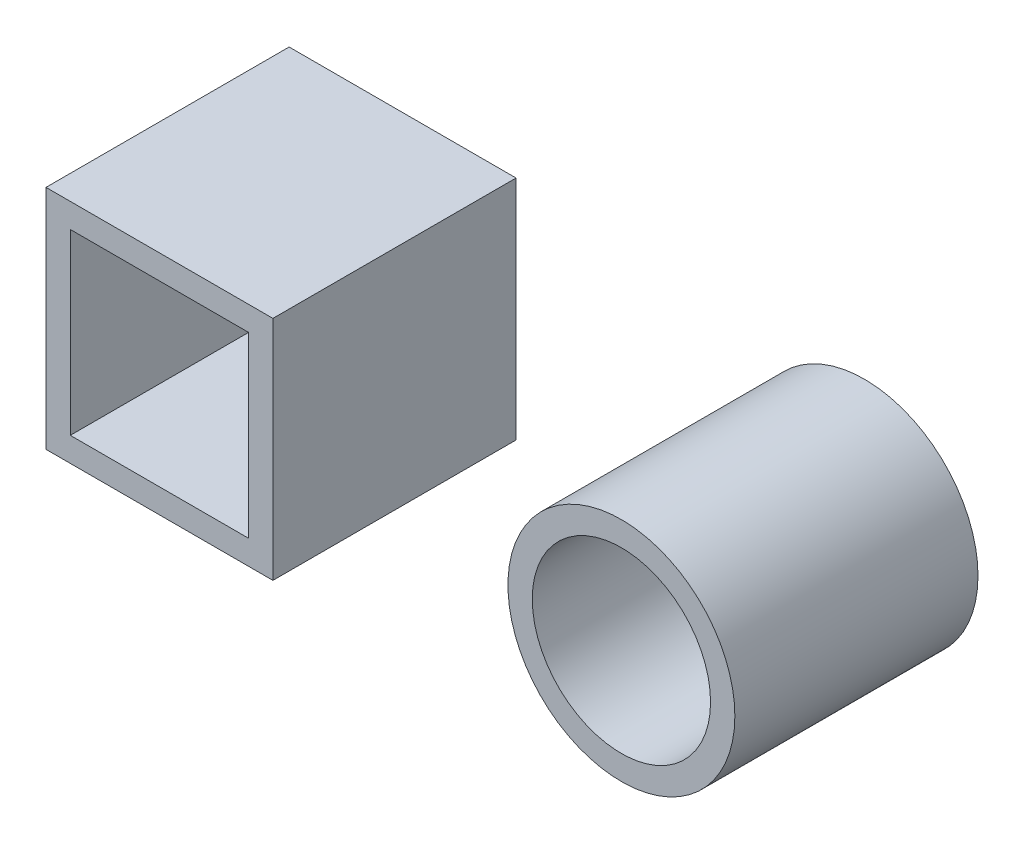
ISO-10303-21;
HEADER;
FILE_DESCRIPTION(('STEP AP214'),'2;1');
FILE_NAME('part.step','',(''),(''),'','','');
FILE_SCHEMA(('AUTOMOTIVE_DESIGN { 1 0 10303 214 1 1 1 1 }'));
ENDSEC;
DATA;
#1=APPLICATION_CONTEXT('core data for automotive mechanical design processes');
#2=APPLICATION_PROTOCOL_DEFINITION('international standard','automotive_design',2000,#1);
#3=PRODUCT_CONTEXT('',#1,'mechanical');
#4=PRODUCT('Part','Part','',(#3));
#5=PRODUCT_RELATED_PRODUCT_CATEGORY('part','',(#4));
#6=PRODUCT_DEFINITION_FORMATION('','',#4);
#7=PRODUCT_DEFINITION_CONTEXT('part definition',#1,'design');
#8=PRODUCT_DEFINITION('design','',#6,#7);
#9=PRODUCT_DEFINITION_SHAPE('','',#8);
#10=(LENGTH_UNIT() NAMED_UNIT(*) SI_UNIT(.MILLI.,.METRE.));
#11=(NAMED_UNIT(*) PLANE_ANGLE_UNIT() SI_UNIT($,.RADIAN.));
#12=(NAMED_UNIT(*) SI_UNIT($,.STERADIAN.) SOLID_ANGLE_UNIT());
#13=UNCERTAINTY_MEASURE_WITH_UNIT(LENGTH_MEASURE(1.E-05),#10,'distance_accuracy_value','');
#14=(GEOMETRIC_REPRESENTATION_CONTEXT(3) GLOBAL_UNCERTAINTY_ASSIGNED_CONTEXT((#13)) GLOBAL_UNIT_ASSIGNED_CONTEXT((#10,
#11,#12)) REPRESENTATION_CONTEXT('',''));
#15=CARTESIAN_POINT('',(0.,0.,0.));
#16=DIRECTION('',(0.,0.,1.));
#17=DIRECTION('',(1.,0.,0.));
#18=AXIS2_PLACEMENT_3D('',#15,#16,#17);
#19=CARTESIAN_POINT('',(72.5,0.,-75.));
#20=DIRECTION('',(0.,0.,1.));
#21=DIRECTION('',(1.,0.,0.));
#22=AXIS2_PLACEMENT_3D('',#19,#20,#21);
#23=CYLINDRICAL_SURFACE('',#22,27.5);
#24=CARTESIAN_POINT('',(72.5,0.,-75.));
#25=DIRECTION('',(0.,0.,1.));
#26=DIRECTION('',(1.,0.,0.));
#27=AXIS2_PLACEMENT_3D('',#24,#25,#26);
#28=CIRCLE('',#27,27.5);
#29=CARTESIAN_POINT('',(100.,0.,-75.));
#30=VERTEX_POINT('',#29);
#31=EDGE_CURVE('E54',#30,#30,#28,.T.);
#32=ORIENTED_EDGE('',*,*,#31,.F.);
#33=EDGE_LOOP('',(#32));
#34=FACE_BOUND('',#33,.T.);
#35=CARTESIAN_POINT('',(72.5,0.,0.));
#36=DIRECTION('',(0.,0.,1.));
#37=DIRECTION('',(1.,0.,0.));
#38=AXIS2_PLACEMENT_3D('',#35,#36,#37);
#39=CIRCLE('',#38,27.5);
#40=CARTESIAN_POINT('',(100.,0.,0.));
#41=VERTEX_POINT('',#40);
#42=EDGE_CURVE('E60',#41,#41,#39,.T.);
#43=ORIENTED_EDGE('',*,*,#42,.T.);
#44=EDGE_LOOP('',(#43));
#45=FACE_BOUND('',#44,.T.);
#46=ADVANCED_FACE('F47',(#34,#45),#23,.F.);
#47=CARTESIAN_POINT('',(72.5,0.,-75.));
#48=DIRECTION('',(0.,0.,1.));
#49=DIRECTION('',(1.,0.,0.));
#50=AXIS2_PLACEMENT_3D('',#47,#48,#49);
#51=CYLINDRICAL_SURFACE('',#50,35.);
#52=CARTESIAN_POINT('',(72.5,0.,-75.));
#53=DIRECTION('',(0.,0.,1.));
#54=DIRECTION('',(1.,0.,0.));
#55=AXIS2_PLACEMENT_3D('',#52,#53,#54);
#56=CIRCLE('',#55,35.);
#57=CARTESIAN_POINT('',(107.5,0.,-75.));
#58=VERTEX_POINT('',#57);
#59=EDGE_CURVE('E11',#58,#58,#56,.T.);
#60=ORIENTED_EDGE('',*,*,#59,.T.);
#61=EDGE_LOOP('',(#60));
#62=FACE_BOUND('',#61,.T.);
#63=CARTESIAN_POINT('',(72.5,0.,0.));
#64=DIRECTION('',(0.,0.,1.));
#65=DIRECTION('',(1.,0.,0.));
#66=AXIS2_PLACEMENT_3D('',#63,#64,#65);
#67=CIRCLE('',#66,35.);
#68=CARTESIAN_POINT('',(107.5,0.,0.));
#69=VERTEX_POINT('',#68);
#70=EDGE_CURVE('E50',#69,#69,#67,.T.);
#71=ORIENTED_EDGE('',*,*,#70,.F.);
#72=EDGE_LOOP('',(#71));
#73=FACE_BOUND('',#72,.T.);
#74=ADVANCED_FACE('F69',(#62,#73),#51,.T.);
#75=CARTESIAN_POINT('',(0.,0.,-75.));
#76=DIRECTION('',(0.,0.,1.));
#77=DIRECTION('',(1.,0.,0.));
#78=AXIS2_PLACEMENT_3D('',#75,#76,#77);
#79=PLANE('',#78);
#80=ORIENTED_EDGE('',*,*,#31,.T.);
#81=EDGE_LOOP('',(#80));
#82=FACE_BOUND('',#81,.T.);
#83=ORIENTED_EDGE('',*,*,#59,.F.);
#84=EDGE_LOOP('',(#83));
#85=FACE_BOUND('',#84,.T.);
#86=ADVANCED_FACE('F71',(#82,#85),#79,.F.);
#87=CARTESIAN_POINT('',(0.,0.,0.));
#88=DIRECTION('',(0.,0.,1.));
#89=DIRECTION('',(1.,0.,0.));
#90=AXIS2_PLACEMENT_3D('',#87,#88,#89);
#91=PLANE('',#90);
#92=ORIENTED_EDGE('',*,*,#42,.F.);
#93=EDGE_LOOP('',(#92));
#94=FACE_BOUND('',#93,.T.);
#95=ORIENTED_EDGE('',*,*,#70,.T.);
#96=EDGE_LOOP('',(#95));
#97=FACE_BOUND('',#96,.T.);
#98=ADVANCED_FACE('F67',(#94,#97),#91,.T.);
#99=CLOSED_SHELL('',(#46,#74,#86,#98));
#100=MANIFOLD_SOLID_BREP('B2',#99);
#101=CARTESIAN_POINT('',(0.,35.,-75.));
#102=DIRECTION('',(0.,1.,0.));
#103=DIRECTION('',(-1.,0.,0.));
#104=AXIS2_PLACEMENT_3D('',#101,#102,#103);
#105=PLANE('',#104);
#106=DIRECTION('',(-1.,0.,0.));
#107=VECTOR('',#106,1.);
#108=CARTESIAN_POINT('',(0.,35.,0.));
#109=LINE('',#108,#107);
#110=CARTESIAN_POINT('',(-35.,35.,0.));
#111=VERTEX_POINT('',#110);
#112=CARTESIAN_POINT('',(-105.,34.9999999999999,0.));
#113=VERTEX_POINT('',#112);
#114=EDGE_CURVE('E229',#111,#113,#109,.T.);
#115=ORIENTED_EDGE('',*,*,#114,.F.);
#116=DIRECTION('',(0.,0.,1.));
#117=VECTOR('',#116,1.);
#118=CARTESIAN_POINT('',(-35.,35.,-75.));
#119=LINE('',#118,#117);
#120=CARTESIAN_POINT('',(-35.,35.,-75.));
#121=VERTEX_POINT('',#120);
#122=EDGE_CURVE('E45',#121,#111,#119,.T.);
#123=ORIENTED_EDGE('',*,*,#122,.F.);
#124=DIRECTION('',(-1.,0.,0.));
#125=VECTOR('',#124,1.);
#126=CARTESIAN_POINT('',(0.,35.,-75.));
#127=LINE('',#126,#125);
#128=CARTESIAN_POINT('',(-105.,34.9999999999999,-75.));
#129=VERTEX_POINT('',#128);
#130=EDGE_CURVE('E205',#121,#129,#127,.T.);
#131=ORIENTED_EDGE('',*,*,#130,.T.);
#132=DIRECTION('',(0.,0.,1.));
#133=VECTOR('',#132,1.);
#134=CARTESIAN_POINT('',(-105.,34.9999999999999,-75.));
#135=LINE('',#134,#133);
#136=EDGE_CURVE('E201',#129,#113,#135,.T.);
#137=ORIENTED_EDGE('',*,*,#136,.T.);
#138=EDGE_LOOP('',(#115,#123,#131,#137));
#139=FACE_BOUND('',#138,.T.);
#140=ADVANCED_FACE('F109',(#139),#105,.T.);
#141=CARTESIAN_POINT('',(-35.,0.,-75.));
#142=DIRECTION('',(-1.,0.,0.));
#143=DIRECTION('',(0.,-1.,0.));
#144=AXIS2_PLACEMENT_3D('',#141,#142,#143);
#145=PLANE('',#144);
#146=DIRECTION('',(0.,-1.,0.));
#147=VECTOR('',#146,1.);
#148=CARTESIAN_POINT('',(-35.,0.,0.));
#149=LINE('',#148,#147);
#150=CARTESIAN_POINT('',(-34.9999999999999,-35.,0.));
#151=VERTEX_POINT('',#150);
#152=EDGE_CURVE('E238',#111,#151,#149,.T.);
#153=ORIENTED_EDGE('',*,*,#152,.T.);
#154=DIRECTION('',(0.,0.,1.));
#155=VECTOR('',#154,1.);
#156=CARTESIAN_POINT('',(-34.9999999999999,-35.,-75.));
#157=LINE('',#156,#155);
#158=CARTESIAN_POINT('',(-34.9999999999999,-35.,-75.));
#159=VERTEX_POINT('',#158);
#160=EDGE_CURVE('E120',#159,#151,#157,.T.);
#161=ORIENTED_EDGE('',*,*,#160,.F.);
#162=DIRECTION('',(0.,-1.,0.));
#163=VECTOR('',#162,1.);
#164=CARTESIAN_POINT('',(-35.,0.,-75.));
#165=LINE('',#164,#163);
#166=EDGE_CURVE('E191',#121,#159,#165,.T.);
#167=ORIENTED_EDGE('',*,*,#166,.F.);
#168=ORIENTED_EDGE('',*,*,#122,.T.);
#169=EDGE_LOOP('',(#153,#161,#167,#168));
#170=FACE_BOUND('',#169,.T.);
#171=ADVANCED_FACE('F288',(#170),#145,.F.);
#172=CARTESIAN_POINT('',(0.,-35.,-75.));
#173=DIRECTION('',(0.,1.,0.));
#174=DIRECTION('',(-1.,0.,0.));
#175=AXIS2_PLACEMENT_3D('',#172,#173,#174);
#176=PLANE('',#175);
#177=DIRECTION('',(-1.,0.,0.));
#178=VECTOR('',#177,1.);
#179=CARTESIAN_POINT('',(0.,-35.,0.));
#180=LINE('',#179,#178);
#181=CARTESIAN_POINT('',(-105.,-35.0000000000001,0.));
#182=VERTEX_POINT('',#181);
#183=EDGE_CURVE('E157',#151,#182,#180,.T.);
#184=ORIENTED_EDGE('',*,*,#183,.T.);
#185=DIRECTION('',(0.,0.,1.));
#186=VECTOR('',#185,1.);
#187=CARTESIAN_POINT('',(-105.,-35.0000000000001,-75.));
#188=LINE('',#187,#186);
#189=CARTESIAN_POINT('',(-105.,-35.0000000000001,-75.));
#190=VERTEX_POINT('',#189);
#191=EDGE_CURVE('E196',#190,#182,#188,.T.);
#192=ORIENTED_EDGE('',*,*,#191,.F.);
#193=DIRECTION('',(-1.,0.,0.));
#194=VECTOR('',#193,1.);
#195=CARTESIAN_POINT('',(0.,-35.,-75.));
#196=LINE('',#195,#194);
#197=EDGE_CURVE('E185',#159,#190,#196,.T.);
#198=ORIENTED_EDGE('',*,*,#197,.F.);
#199=ORIENTED_EDGE('',*,*,#160,.T.);
#200=EDGE_LOOP('',(#184,#192,#198,#199));
#201=FACE_BOUND('',#200,.T.);
#202=ADVANCED_FACE('F197',(#201),#176,.F.);
#203=CARTESIAN_POINT('',(-97.5,0.,-75.));
#204=DIRECTION('',(-1.,0.,0.));
#205=DIRECTION('',(0.,-1.,0.));
#206=AXIS2_PLACEMENT_3D('',#203,#204,#205);
#207=PLANE('',#206);
#208=DIRECTION('',(0.,-1.,0.));
#209=VECTOR('',#208,1.);
#210=CARTESIAN_POINT('',(-97.5,0.,0.));
#211=LINE('',#210,#209);
#212=CARTESIAN_POINT('',(-97.5,27.5,0.));
#213=VERTEX_POINT('',#212);
#214=CARTESIAN_POINT('',(-97.5,-27.5,0.));
#215=VERTEX_POINT('',#214);
#216=EDGE_CURVE('E214',#213,#215,#211,.T.);
#217=ORIENTED_EDGE('',*,*,#216,.T.);
#218=DIRECTION('',(0.,0.,1.));
#219=VECTOR('',#218,1.);
#220=CARTESIAN_POINT('',(-97.5,-27.5,-75.));
#221=LINE('',#220,#219);
#222=CARTESIAN_POINT('',(-97.5,-27.5,-75.));
#223=VERTEX_POINT('',#222);
#224=EDGE_CURVE('E246',#223,#215,#221,.T.);
#225=ORIENTED_EDGE('',*,*,#224,.F.);
#226=DIRECTION('',(0.,-1.,0.));
#227=VECTOR('',#226,1.);
#228=CARTESIAN_POINT('',(-97.5,0.,-75.));
#229=LINE('',#228,#227);
#230=CARTESIAN_POINT('',(-97.5,27.5,-75.));
#231=VERTEX_POINT('',#230);
#232=EDGE_CURVE('E240',#231,#223,#229,.T.);
#233=ORIENTED_EDGE('',*,*,#232,.F.);
#234=DIRECTION('',(0.,0.,1.));
#235=VECTOR('',#234,1.);
#236=CARTESIAN_POINT('',(-97.5,27.5,-75.));
#237=LINE('',#236,#235);
#238=EDGE_CURVE('E113',#231,#213,#237,.T.);
#239=ORIENTED_EDGE('',*,*,#238,.T.);
#240=EDGE_LOOP('',(#217,#225,#233,#239));
#241=FACE_BOUND('',#240,.T.);
#242=ADVANCED_FACE('F111',(#241),#207,.F.);
#243=CARTESIAN_POINT('',(0.,-27.4999999999999,-75.));
#244=DIRECTION('',(0.,1.,0.));
#245=DIRECTION('',(-1.,0.,0.));
#246=AXIS2_PLACEMENT_3D('',#243,#244,#245);
#247=PLANE('',#246);
#248=DIRECTION('',(-1.,0.,0.));
#249=VECTOR('',#248,1.);
#250=CARTESIAN_POINT('',(0.,-27.4999999999999,0.));
#251=LINE('',#250,#249);
#252=CARTESIAN_POINT('',(-42.5,-27.4999999999999,0.));
#253=VERTEX_POINT('',#252);
#254=EDGE_CURVE('E225',#253,#215,#251,.T.);
#255=ORIENTED_EDGE('',*,*,#254,.F.);
#256=DIRECTION('',(0.,0.,1.));
#257=VECTOR('',#256,1.);
#258=CARTESIAN_POINT('',(-42.5,-27.4999999999999,-75.));
#259=LINE('',#258,#257);
#260=CARTESIAN_POINT('',(-42.5,-27.4999999999999,-75.));
#261=VERTEX_POINT('',#260);
#262=EDGE_CURVE('E249',#261,#253,#259,.T.);
#263=ORIENTED_EDGE('',*,*,#262,.F.);
#264=DIRECTION('',(-1.,0.,0.));
#265=VECTOR('',#264,1.);
#266=CARTESIAN_POINT('',(0.,-27.4999999999999,-75.));
#267=LINE('',#266,#265);
#268=EDGE_CURVE('E208',#261,#223,#267,.T.);
#269=ORIENTED_EDGE('',*,*,#268,.T.);
#270=ORIENTED_EDGE('',*,*,#224,.T.);
#271=EDGE_LOOP('',(#255,#263,#269,#270));
#272=FACE_BOUND('',#271,.T.);
#273=ADVANCED_FACE('F266',(#272),#247,.T.);
#274=CARTESIAN_POINT('',(-42.5,0.,-75.));
#275=DIRECTION('',(-1.,0.,0.));
#276=DIRECTION('',(0.,-1.,0.));
#277=AXIS2_PLACEMENT_3D('',#274,#275,#276);
#278=PLANE('',#277);
#279=DIRECTION('',(0.,-1.,0.));
#280=VECTOR('',#279,1.);
#281=CARTESIAN_POINT('',(-42.5,0.,0.));
#282=LINE('',#281,#280);
#283=CARTESIAN_POINT('',(-42.5,27.5000000000001,0.));
#284=VERTEX_POINT('',#283);
#285=EDGE_CURVE('E221',#284,#253,#282,.T.);
#286=ORIENTED_EDGE('',*,*,#285,.F.);
#287=DIRECTION('',(0.,0.,1.));
#288=VECTOR('',#287,1.);
#289=CARTESIAN_POINT('',(-42.5,27.5000000000001,-75.));
#290=LINE('',#289,#288);
#291=CARTESIAN_POINT('',(-42.5,27.5000000000001,-75.));
#292=VERTEX_POINT('',#291);
#293=EDGE_CURVE('E251',#292,#284,#290,.T.);
#294=ORIENTED_EDGE('',*,*,#293,.F.);
#295=DIRECTION('',(0.,-1.,0.));
#296=VECTOR('',#295,1.);
#297=CARTESIAN_POINT('',(-42.5,0.,-75.));
#298=LINE('',#297,#296);
#299=EDGE_CURVE('E271',#292,#261,#298,.T.);
#300=ORIENTED_EDGE('',*,*,#299,.T.);
#301=ORIENTED_EDGE('',*,*,#262,.T.);
#302=EDGE_LOOP('',(#286,#294,#300,#301));
#303=FACE_BOUND('',#302,.T.);
#304=ADVANCED_FACE('F298',(#303),#278,.T.);
#305=CARTESIAN_POINT('',(0.,27.5000000000001,-75.));
#306=DIRECTION('',(0.,1.,0.));
#307=DIRECTION('',(-1.,0.,0.));
#308=AXIS2_PLACEMENT_3D('',#305,#306,#307);
#309=PLANE('',#308);
#310=DIRECTION('',(-1.,0.,0.));
#311=VECTOR('',#310,1.);
#312=CARTESIAN_POINT('',(0.,27.5000000000001,0.));
#313=LINE('',#312,#311);
#314=EDGE_CURVE('E218',#284,#213,#313,.T.);
#315=ORIENTED_EDGE('',*,*,#314,.T.);
#316=ORIENTED_EDGE('',*,*,#238,.F.);
#317=DIRECTION('',(-1.,0.,0.));
#318=VECTOR('',#317,1.);
#319=CARTESIAN_POINT('',(0.,27.5000000000001,-75.));
#320=LINE('',#319,#318);
#321=EDGE_CURVE('E169',#292,#231,#320,.T.);
#322=ORIENTED_EDGE('',*,*,#321,.F.);
#323=ORIENTED_EDGE('',*,*,#293,.T.);
#324=EDGE_LOOP('',(#315,#316,#322,#323));
#325=FACE_BOUND('',#324,.T.);
#326=ADVANCED_FACE('F285',(#325),#309,.F.);
#327=CARTESIAN_POINT('',(-105.,0.,-75.));
#328=DIRECTION('',(-1.,0.,0.));
#329=DIRECTION('',(0.,-1.,0.));
#330=AXIS2_PLACEMENT_3D('',#327,#328,#329);
#331=PLANE('',#330);
#332=DIRECTION('',(0.,-1.,0.));
#333=VECTOR('',#332,1.);
#334=CARTESIAN_POINT('',(-105.,0.,0.));
#335=LINE('',#334,#333);
#336=EDGE_CURVE('E233',#113,#182,#335,.T.);
#337=ORIENTED_EDGE('',*,*,#336,.F.);
#338=ORIENTED_EDGE('',*,*,#136,.F.);
#339=DIRECTION('',(0.,-1.,0.));
#340=VECTOR('',#339,1.);
#341=CARTESIAN_POINT('',(-105.,0.,-75.));
#342=LINE('',#341,#340);
#343=EDGE_CURVE('E190',#129,#190,#342,.T.);
#344=ORIENTED_EDGE('',*,*,#343,.T.);
#345=ORIENTED_EDGE('',*,*,#191,.T.);
#346=EDGE_LOOP('',(#337,#338,#344,#345));
#347=FACE_BOUND('',#346,.T.);
#348=ADVANCED_FACE('F203',(#347),#331,.T.);
#349=CARTESIAN_POINT('',(0.,0.,-75.));
#350=DIRECTION('',(0.,0.,1.));
#351=DIRECTION('',(1.,0.,0.));
#352=AXIS2_PLACEMENT_3D('',#349,#350,#351);
#353=PLANE('',#352);
#354=ORIENTED_EDGE('',*,*,#232,.T.);
#355=ORIENTED_EDGE('',*,*,#268,.F.);
#356=ORIENTED_EDGE('',*,*,#299,.F.);
#357=ORIENTED_EDGE('',*,*,#321,.T.);
#358=EDGE_LOOP('',(#354,#355,#356,#357));
#359=FACE_BOUND('',#358,.T.);
#360=ORIENTED_EDGE('',*,*,#130,.F.);
#361=ORIENTED_EDGE('',*,*,#166,.T.);
#362=ORIENTED_EDGE('',*,*,#197,.T.);
#363=ORIENTED_EDGE('',*,*,#343,.F.);
#364=EDGE_LOOP('',(#360,#361,#362,#363));
#365=FACE_BOUND('',#364,.T.);
#366=ADVANCED_FACE('F188',(#359,#365),#353,.F.);
#367=CARTESIAN_POINT('',(0.,0.,0.));
#368=DIRECTION('',(0.,0.,1.));
#369=DIRECTION('',(1.,0.,0.));
#370=AXIS2_PLACEMENT_3D('',#367,#368,#369);
#371=PLANE('',#370);
#372=ORIENTED_EDGE('',*,*,#216,.F.);
#373=ORIENTED_EDGE('',*,*,#314,.F.);
#374=ORIENTED_EDGE('',*,*,#285,.T.);
#375=ORIENTED_EDGE('',*,*,#254,.T.);
#376=EDGE_LOOP('',(#372,#373,#374,#375));
#377=FACE_BOUND('',#376,.T.);
#378=ORIENTED_EDGE('',*,*,#114,.T.);
#379=ORIENTED_EDGE('',*,*,#336,.T.);
#380=ORIENTED_EDGE('',*,*,#183,.F.);
#381=ORIENTED_EDGE('',*,*,#152,.F.);
#382=EDGE_LOOP('',(#378,#379,#380,#381));
#383=FACE_BOUND('',#382,.T.);
#384=ADVANCED_FACE('F262',(#377,#383),#371,.T.);
#385=CLOSED_SHELL('',(#140,#171,#202,#242,#273,#304,#326,#348,#366,#384));
#386=MANIFOLD_SOLID_BREP('B6',#385);
#387=ADVANCED_BREP_SHAPE_REPRESENTATION('',(#18,#100,#386),#14);
#388=SHAPE_DEFINITION_REPRESENTATION(#9,#387);
ENDSEC;
END-ISO-10303-21;
